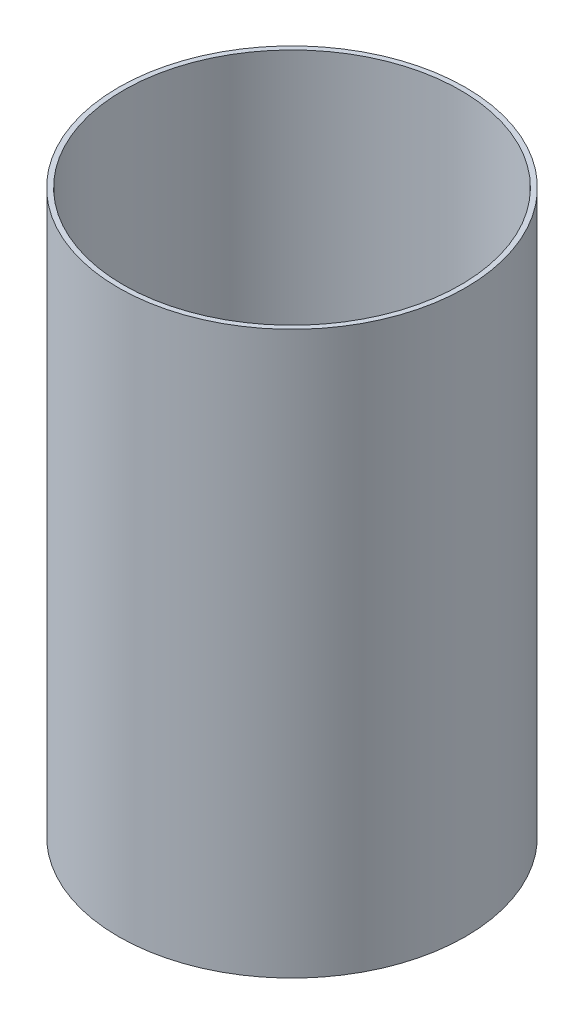
ISO-10303-21;
HEADER;
FILE_DESCRIPTION(('STEP AP214'),'2;1');
FILE_NAME('part.step','',(''),(''),'','','');
FILE_SCHEMA(('AUTOMOTIVE_DESIGN { 1 0 10303 214 1 1 1 1 }'));
ENDSEC;
DATA;
#1=APPLICATION_CONTEXT('core data for automotive mechanical design processes');
#2=APPLICATION_PROTOCOL_DEFINITION('international standard','automotive_design',2000,#1);
#3=PRODUCT_CONTEXT('',#1,'mechanical');
#4=PRODUCT('Part','Part','',(#3));
#5=PRODUCT_RELATED_PRODUCT_CATEGORY('part','',(#4));
#6=PRODUCT_DEFINITION_FORMATION('','',#4);
#7=PRODUCT_DEFINITION_CONTEXT('part definition',#1,'design');
#8=PRODUCT_DEFINITION('design','',#6,#7);
#9=PRODUCT_DEFINITION_SHAPE('','',#8);
#10=(LENGTH_UNIT() NAMED_UNIT(*) SI_UNIT(.MILLI.,.METRE.));
#11=(NAMED_UNIT(*) PLANE_ANGLE_UNIT() SI_UNIT($,.RADIAN.));
#12=(NAMED_UNIT(*) SI_UNIT($,.STERADIAN.) SOLID_ANGLE_UNIT());
#13=UNCERTAINTY_MEASURE_WITH_UNIT(LENGTH_MEASURE(1.E-05),#10,'distance_accuracy_value','');
#14=(GEOMETRIC_REPRESENTATION_CONTEXT(3) GLOBAL_UNCERTAINTY_ASSIGNED_CONTEXT((#13)) GLOBAL_UNIT_ASSIGNED_CONTEXT((#10,
#11,#12)) REPRESENTATION_CONTEXT('',''));
#15=CARTESIAN_POINT('',(0.,0.,0.));
#16=DIRECTION('',(0.,0.,1.));
#17=DIRECTION('',(1.,0.,0.));
#18=AXIS2_PLACEMENT_3D('',#15,#16,#17);
#19=CARTESIAN_POINT('',(0.,-2.66532960180643,0.));
#20=DIRECTION('',(0.,1.,0.));
#21=DIRECTION('',(0.,0.,1.));
#22=AXIS2_PLACEMENT_3D('',#19,#20,#21);
#23=CYLINDRICAL_SURFACE('',#22,1.75);
#24=CARTESIAN_POINT('',(0.,-2.66532960180643,0.));
#25=DIRECTION('',(0.,1.,0.));
#26=DIRECTION('',(0.,0.,1.));
#27=AXIS2_PLACEMENT_3D('',#24,#25,#26);
#28=CIRCLE('',#27,1.75);
#29=CARTESIAN_POINT('',(0.,-2.66532960180643,1.75));
#30=VERTEX_POINT('',#29);
#31=EDGE_CURVE('E10',#30,#30,#28,.T.);
#32=ORIENTED_EDGE('',*,*,#31,.T.);
#33=EDGE_LOOP('',(#32));
#34=FACE_BOUND('',#33,.T.);
#35=CARTESIAN_POINT('',(0.,3.,0.));
#36=DIRECTION('',(0.,1.,0.));
#37=DIRECTION('',(0.,0.,1.));
#38=AXIS2_PLACEMENT_3D('',#35,#36,#37);
#39=CIRCLE('',#38,1.75);
#40=CARTESIAN_POINT('',(0.,3.,1.75));
#41=VERTEX_POINT('',#40);
#42=EDGE_CURVE('E51',#41,#41,#39,.T.);
#43=ORIENTED_EDGE('',*,*,#42,.F.);
#44=EDGE_LOOP('',(#43));
#45=FACE_BOUND('',#44,.T.);
#46=ADVANCED_FACE('F43',(#34,#45),#23,.T.);
#47=CARTESIAN_POINT('',(0.,-2.66532960180643,0.));
#48=DIRECTION('',(0.,1.,0.));
#49=DIRECTION('',(0.,0.,1.));
#50=AXIS2_PLACEMENT_3D('',#47,#48,#49);
#51=PLANE('',#50);
#52=ORIENTED_EDGE('',*,*,#31,.F.);
#53=EDGE_LOOP('',(#52));
#54=FACE_BOUND('',#53,.T.);
#55=ADVANCED_FACE('F73',(#54),#51,.F.);
#56=CARTESIAN_POINT('',(0.,3.,0.));
#57=DIRECTION('',(0.,1.,0.));
#58=DIRECTION('',(0.,0.,1.));
#59=AXIS2_PLACEMENT_3D('',#56,#57,#58);
#60=PLANE('',#59);
#61=CARTESIAN_POINT('',(0.,3.,0.));
#62=DIRECTION('',(0.,1.,0.));
#63=DIRECTION('',(0.,0.,1.));
#64=AXIS2_PLACEMENT_3D('',#61,#62,#63);
#65=CIRCLE('',#64,1.7);
#66=CARTESIAN_POINT('',(0.,3.,1.7));
#67=VERTEX_POINT('',#66);
#68=EDGE_CURVE('E46',#67,#67,#65,.T.);
#69=ORIENTED_EDGE('',*,*,#68,.F.);
#70=EDGE_LOOP('',(#69));
#71=FACE_BOUND('',#70,.T.);
#72=ORIENTED_EDGE('',*,*,#42,.T.);
#73=EDGE_LOOP('',(#72));
#74=FACE_BOUND('',#73,.T.);
#75=ADVANCED_FACE('F70',(#71,#74),#60,.T.);
#76=CARTESIAN_POINT('',(0.,0.,0.));
#77=DIRECTION('',(0.,1.,0.));
#78=DIRECTION('',(0.,0.,1.));
#79=AXIS2_PLACEMENT_3D('',#76,#77,#78);
#80=CYLINDRICAL_SURFACE('',#79,1.7);
#81=ORIENTED_EDGE('',*,*,#68,.T.);
#82=EDGE_LOOP('',(#81));
#83=FACE_BOUND('',#82,.T.);
#84=CARTESIAN_POINT('',(0.,0.,0.));
#85=DIRECTION('',(0.,1.,0.));
#86=DIRECTION('',(0.,0.,1.));
#87=AXIS2_PLACEMENT_3D('',#84,#85,#86);
#88=CIRCLE('',#87,1.7);
#89=CARTESIAN_POINT('',(0.,0.,1.7));
#90=VERTEX_POINT('',#89);
#91=EDGE_CURVE('E58',#90,#90,#88,.T.);
#92=ORIENTED_EDGE('',*,*,#91,.F.);
#93=EDGE_LOOP('',(#92));
#94=FACE_BOUND('',#93,.T.);
#95=ADVANCED_FACE('F67',(#83,#94),#80,.F.);
#96=CARTESIAN_POINT('',(0.,0.,0.));
#97=DIRECTION('',(0.,1.,0.));
#98=DIRECTION('',(0.,0.,1.));
#99=AXIS2_PLACEMENT_3D('',#96,#97,#98);
#100=PLANE('',#99);
#101=ORIENTED_EDGE('',*,*,#91,.T.);
#102=EDGE_LOOP('',(#101));
#103=FACE_BOUND('',#102,.T.);
#104=ADVANCED_FACE('F87',(#103),#100,.T.);
#105=CLOSED_SHELL('',(#46,#55,#75,#95,#104));
#106=MANIFOLD_SOLID_BREP('B2',#105);
#107=ADVANCED_BREP_SHAPE_REPRESENTATION('',(#18,#106),#14);
#108=SHAPE_DEFINITION_REPRESENTATION(#9,#107);
ENDSEC;
END-ISO-10303-21;
